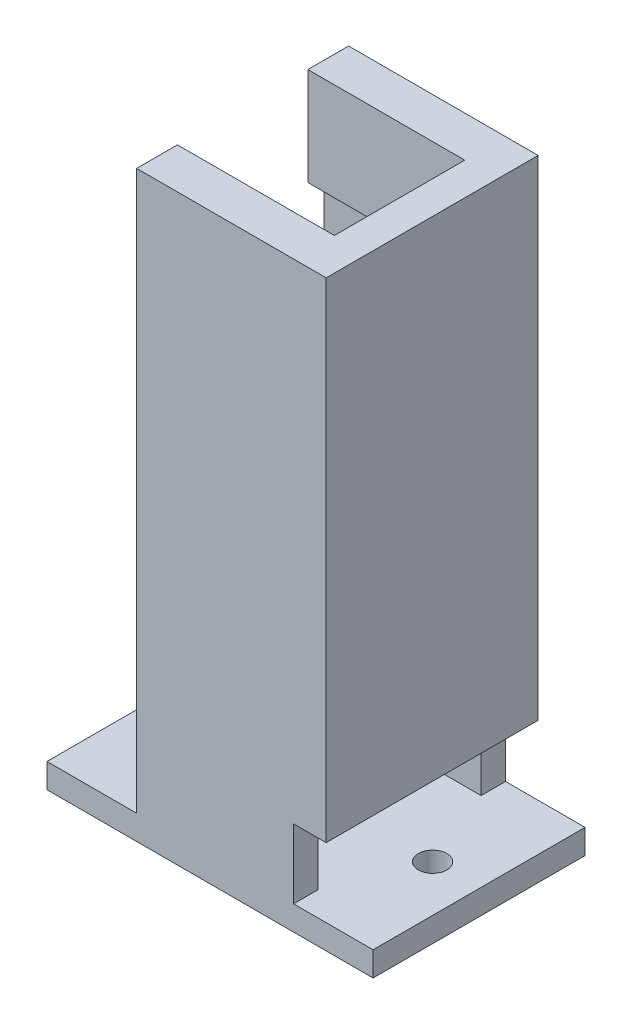
ISO-10303-21;
HEADER;
FILE_DESCRIPTION(('STEP AP214'),'2;1');
FILE_NAME('part.step','',(''),(''),'','','');
FILE_SCHEMA(('AUTOMOTIVE_DESIGN { 1 0 10303 214 1 1 1 1 }'));
ENDSEC;
DATA;
#1=APPLICATION_CONTEXT('core data for automotive mechanical design processes');
#2=APPLICATION_PROTOCOL_DEFINITION('international standard','automotive_design',2000,#1);
#3=PRODUCT_CONTEXT('',#1,'mechanical');
#4=PRODUCT('Part','Part','',(#3));
#5=PRODUCT_RELATED_PRODUCT_CATEGORY('part','',(#4));
#6=PRODUCT_DEFINITION_FORMATION('','',#4);
#7=PRODUCT_DEFINITION_CONTEXT('part definition',#1,'design');
#8=PRODUCT_DEFINITION('design','',#6,#7);
#9=PRODUCT_DEFINITION_SHAPE('','',#8);
#10=(LENGTH_UNIT() NAMED_UNIT(*) SI_UNIT(.MILLI.,.METRE.));
#11=(NAMED_UNIT(*) PLANE_ANGLE_UNIT() SI_UNIT($,.RADIAN.));
#12=(NAMED_UNIT(*) SI_UNIT($,.STERADIAN.) SOLID_ANGLE_UNIT());
#13=UNCERTAINTY_MEASURE_WITH_UNIT(LENGTH_MEASURE(1.E-05),#10,'distance_accuracy_value','');
#14=(GEOMETRIC_REPRESENTATION_CONTEXT(3) GLOBAL_UNCERTAINTY_ASSIGNED_CONTEXT((#13)) GLOBAL_UNIT_ASSIGNED_CONTEXT((#10,
#11,#12)) REPRESENTATION_CONTEXT('',''));
#15=CARTESIAN_POINT('',(0.,0.,0.));
#16=DIRECTION('',(0.,0.,1.));
#17=DIRECTION('',(1.,0.,0.));
#18=AXIS2_PLACEMENT_3D('',#15,#16,#17);
#19=CARTESIAN_POINT('',(10.25,59.5,13.));
#20=DIRECTION('',(-1.,0.,0.));
#21=DIRECTION('',(0.,0.,1.));
#22=AXIS2_PLACEMENT_3D('',#19,#20,#21);
#23=PLANE('',#22);
#24=DIRECTION('',(0.,0.,-1.));
#25=VECTOR('',#24,1.);
#26=CARTESIAN_POINT('',(10.25,11.5,13.));
#27=LINE('',#26,#25);
#28=CARTESIAN_POINT('',(10.25,11.5,13.));
#29=VERTEX_POINT('',#28);
#30=CARTESIAN_POINT('',(10.25,11.5,10.));
#31=VERTEX_POINT('',#30);
#32=EDGE_CURVE('E56',#29,#31,#27,.T.);
#33=ORIENTED_EDGE('',*,*,#32,.F.);
#34=DIRECTION('',(0.,-1.,0.));
#35=VECTOR('',#34,1.);
#36=CARTESIAN_POINT('',(10.25,59.5,13.));
#37=LINE('',#36,#35);
#38=CARTESIAN_POINT('',(10.25,3.,13.));
#39=VERTEX_POINT('',#38);
#40=EDGE_CURVE('E198',#29,#39,#37,.T.);
#41=ORIENTED_EDGE('',*,*,#40,.T.);
#42=DIRECTION('',(0.,0.,-1.));
#43=VECTOR('',#42,1.);
#44=CARTESIAN_POINT('',(10.25,3.,13.));
#45=LINE('',#44,#43);
#46=CARTESIAN_POINT('',(10.25,3.,10.));
#47=VERTEX_POINT('',#46);
#48=EDGE_CURVE('E305',#39,#47,#45,.T.);
#49=ORIENTED_EDGE('',*,*,#48,.T.);
#50=DIRECTION('',(0.,-1.,0.));
#51=VECTOR('',#50,1.);
#52=CARTESIAN_POINT('',(10.25,59.5,10.));
#53=LINE('',#52,#51);
#54=EDGE_CURVE('E61',#31,#47,#53,.T.);
#55=ORIENTED_EDGE('',*,*,#54,.F.);
#56=EDGE_LOOP('',(#33,#41,#49,#55));
#57=FACE_BOUND('',#56,.T.);
#58=ADVANCED_FACE('F39',(#57),#23,.F.);
#59=CARTESIAN_POINT('',(10.25,59.5,-13.));
#60=DIRECTION('',(-1.,0.,0.));
#61=DIRECTION('',(0.,0.,1.));
#62=AXIS2_PLACEMENT_3D('',#59,#60,#61);
#63=PLANE('',#62);
#64=CARTESIAN_POINT('',(10.25,11.5,-9.99999999999999));
#65=VERTEX_POINT('',#64);
#66=CARTESIAN_POINT('',(10.25,11.5,-13.));
#67=VERTEX_POINT('',#66);
#68=EDGE_CURVE('E485',#65,#67,#27,.T.);
#69=ORIENTED_EDGE('',*,*,#68,.F.);
#70=DIRECTION('',(0.,-1.,0.));
#71=VECTOR('',#70,1.);
#72=CARTESIAN_POINT('',(10.25,59.5,-10.));
#73=LINE('',#72,#71);
#74=CARTESIAN_POINT('',(10.25,3.,-10.));
#75=VERTEX_POINT('',#74);
#76=EDGE_CURVE('E288',#65,#75,#73,.T.);
#77=ORIENTED_EDGE('',*,*,#76,.T.);
#78=DIRECTION('',(0.,0.,-1.));
#79=VECTOR('',#78,1.);
#80=CARTESIAN_POINT('',(10.25,3.,-13.));
#81=LINE('',#80,#79);
#82=CARTESIAN_POINT('',(10.25,3.,-13.));
#83=VERTEX_POINT('',#82);
#84=EDGE_CURVE('E272',#75,#83,#81,.T.);
#85=ORIENTED_EDGE('',*,*,#84,.T.);
#86=DIRECTION('',(0.,-1.,0.));
#87=VECTOR('',#86,1.);
#88=CARTESIAN_POINT('',(10.25,59.5,-13.));
#89=LINE('',#88,#87);
#90=EDGE_CURVE('E285',#67,#83,#89,.T.);
#91=ORIENTED_EDGE('',*,*,#90,.F.);
#92=EDGE_LOOP('',(#69,#77,#85,#91));
#93=FACE_BOUND('',#92,.T.);
#94=ADVANCED_FACE('F425',(#93),#63,.F.);
#95=CARTESIAN_POINT('',(0.,3.,0.));
#96=DIRECTION('',(0.,1.,0.));
#97=DIRECTION('',(0.,0.,1.));
#98=AXIS2_PLACEMENT_3D('',#95,#96,#97);
#99=PLANE('',#98);
#100=CARTESIAN_POINT('',(0.,3.,0.));
#101=DIRECTION('',(0.,1.,0.));
#102=DIRECTION('',(0.,0.,1.));
#103=AXIS2_PLACEMENT_3D('',#100,#101,#102);
#104=CIRCLE('',#103,2.5);
#105=CARTESIAN_POINT('',(0.,3.,2.5));
#106=VERTEX_POINT('',#105);
#107=EDGE_CURVE('E200',#106,#106,#104,.T.);
#108=ORIENTED_EDGE('',*,*,#107,.F.);
#109=EDGE_LOOP('',(#108));
#110=FACE_BOUND('',#109,.T.);
#111=CARTESIAN_POINT('',(14.3,3.,0.));
#112=DIRECTION('',(0.,1.,0.));
#113=DIRECTION('',(0.,0.,1.));
#114=AXIS2_PLACEMENT_3D('',#111,#112,#113);
#115=CIRCLE('',#114,1.75);
#116=CARTESIAN_POINT('',(14.3,3.,1.74999999999999));
#117=VERTEX_POINT('',#116);
#118=EDGE_CURVE('E329',#117,#117,#115,.T.);
#119=ORIENTED_EDGE('',*,*,#118,.F.);
#120=EDGE_LOOP('',(#119));
#121=FACE_BOUND('',#120,.T.);
#122=CARTESIAN_POINT('',(-14.3,3.,0.));
#123=DIRECTION('',(0.,1.,0.));
#124=DIRECTION('',(0.,0.,-1.));
#125=AXIS2_PLACEMENT_3D('',#122,#123,#124);
#126=CIRCLE('',#125,1.75000000000001);
#127=CARTESIAN_POINT('',(-14.3,3.,-1.75000000000001));
#128=VERTEX_POINT('',#127);
#129=EDGE_CURVE('E323',#128,#128,#126,.T.);
#130=ORIENTED_EDGE('',*,*,#129,.F.);
#131=EDGE_LOOP('',(#130));
#132=FACE_BOUND('',#131,.T.);
#133=DIRECTION('',(1.,0.,0.));
#134=VECTOR('',#133,1.);
#135=CARTESIAN_POINT('',(-9.00000000000001,3.,-10.));
#136=LINE('',#135,#134);
#137=CARTESIAN_POINT('',(-9.00000000000001,3.,-10.));
#138=VERTEX_POINT('',#137);
#139=EDGE_CURVE('E276',#138,#75,#136,.T.);
#140=ORIENTED_EDGE('',*,*,#139,.F.);
#141=DIRECTION('',(0.,0.,1.));
#142=VECTOR('',#141,1.);
#143=CARTESIAN_POINT('',(-9.00000000000001,3.,-13.));
#144=LINE('',#143,#142);
#145=CARTESIAN_POINT('',(-9.00000000000001,3.,-13.));
#146=VERTEX_POINT('',#145);
#147=EDGE_CURVE('E266',#146,#138,#144,.T.);
#148=ORIENTED_EDGE('',*,*,#147,.F.);
#149=DIRECTION('',(1.,0.,0.));
#150=VECTOR('',#149,1.);
#151=CARTESIAN_POINT('',(-20.,3.,-13.));
#152=LINE('',#151,#150);
#153=CARTESIAN_POINT('',(-20.,3.,-13.));
#154=VERTEX_POINT('',#153);
#155=EDGE_CURVE('E354',#154,#146,#152,.T.);
#156=ORIENTED_EDGE('',*,*,#155,.F.);
#157=DIRECTION('',(0.,0.,1.));
#158=VECTOR('',#157,1.);
#159=CARTESIAN_POINT('',(-20.,3.,-13.));
#160=LINE('',#159,#158);
#161=CARTESIAN_POINT('',(-20.,3.,13.));
#162=VERTEX_POINT('',#161);
#163=EDGE_CURVE('E340',#154,#162,#160,.T.);
#164=ORIENTED_EDGE('',*,*,#163,.T.);
#165=DIRECTION('',(1.,0.,0.));
#166=VECTOR('',#165,1.);
#167=CARTESIAN_POINT('',(-20.,3.,13.));
#168=LINE('',#167,#166);
#169=CARTESIAN_POINT('',(-9.00000000000001,3.,13.));
#170=VERTEX_POINT('',#169);
#171=EDGE_CURVE('E346',#162,#170,#168,.T.);
#172=ORIENTED_EDGE('',*,*,#171,.T.);
#173=DIRECTION('',(0.,0.,1.));
#174=VECTOR('',#173,1.);
#175=CARTESIAN_POINT('',(-9.00000000000001,3.,13.));
#176=LINE('',#175,#174);
#177=CARTESIAN_POINT('',(-9.00000000000001,3.,10.));
#178=VERTEX_POINT('',#177);
#179=EDGE_CURVE('E295',#178,#170,#176,.T.);
#180=ORIENTED_EDGE('',*,*,#179,.F.);
#181=DIRECTION('',(-1.,0.,0.));
#182=VECTOR('',#181,1.);
#183=CARTESIAN_POINT('',(-9.00000000000001,3.,10.));
#184=LINE('',#183,#182);
#185=EDGE_CURVE('E301',#47,#178,#184,.T.);
#186=ORIENTED_EDGE('',*,*,#185,.F.);
#187=ORIENTED_EDGE('',*,*,#48,.F.);
#188=CARTESIAN_POINT('',(20.,3.,13.));
#189=VERTEX_POINT('',#188);
#190=EDGE_CURVE('E344',#39,#189,#168,.T.);
#191=ORIENTED_EDGE('',*,*,#190,.T.);
#192=DIRECTION('',(0.,0.,1.));
#193=VECTOR('',#192,1.);
#194=CARTESIAN_POINT('',(20.,3.,-13.));
#195=LINE('',#194,#193);
#196=CARTESIAN_POINT('',(20.,3.,-13.));
#197=VERTEX_POINT('',#196);
#198=EDGE_CURVE('E349',#197,#189,#195,.T.);
#199=ORIENTED_EDGE('',*,*,#198,.F.);
#200=EDGE_CURVE('E353',#83,#197,#152,.T.);
#201=ORIENTED_EDGE('',*,*,#200,.F.);
#202=ORIENTED_EDGE('',*,*,#84,.F.);
#203=EDGE_LOOP('',(#140,#148,#156,#164,#172,#180,#186,#187,#191,#199,#201,#202));
#204=FACE_BOUND('',#203,.T.);
#205=ADVANCED_FACE('F395',(#110,#121,#132,#204),#99,.T.);
#206=CARTESIAN_POINT('',(-20.,3.,-13.));
#207=DIRECTION('',(1.,0.,0.));
#208=DIRECTION('',(0.,0.,-1.));
#209=AXIS2_PLACEMENT_3D('',#206,#207,#208);
#210=PLANE('',#209);
#211=DIRECTION('',(0.,0.,1.));
#212=VECTOR('',#211,1.);
#213=CARTESIAN_POINT('',(-20.,0.,-13.));
#214=LINE('',#213,#212);
#215=CARTESIAN_POINT('',(-20.,0.,-13.));
#216=VERTEX_POINT('',#215);
#217=CARTESIAN_POINT('',(-20.,0.,13.));
#218=VERTEX_POINT('',#217);
#219=EDGE_CURVE('E328',#216,#218,#214,.T.);
#220=ORIENTED_EDGE('',*,*,#219,.T.);
#221=DIRECTION('',(0.,-1.,0.));
#222=VECTOR('',#221,1.);
#223=CARTESIAN_POINT('',(-20.,3.,13.));
#224=LINE('',#223,#222);
#225=EDGE_CURVE('E11',#162,#218,#224,.T.);
#226=ORIENTED_EDGE('',*,*,#225,.F.);
#227=ORIENTED_EDGE('',*,*,#163,.F.);
#228=DIRECTION('',(0.,-1.,0.));
#229=VECTOR('',#228,1.);
#230=CARTESIAN_POINT('',(-20.,3.,-13.));
#231=LINE('',#230,#229);
#232=EDGE_CURVE('E358',#154,#216,#231,.T.);
#233=ORIENTED_EDGE('',*,*,#232,.T.);
#234=EDGE_LOOP('',(#220,#226,#227,#233));
#235=FACE_BOUND('',#234,.T.);
#236=ADVANCED_FACE('F41',(#235),#210,.F.);
#237=CARTESIAN_POINT('',(-20.,3.,13.));
#238=DIRECTION('',(0.,0.,-1.));
#239=DIRECTION('',(-1.,0.,0.));
#240=AXIS2_PLACEMENT_3D('',#237,#238,#239);
#241=PLANE('',#240);
#242=DIRECTION('',(1.,0.,0.));
#243=VECTOR('',#242,1.);
#244=CARTESIAN_POINT('',(-20.,0.,13.));
#245=LINE('',#244,#243);
#246=CARTESIAN_POINT('',(20.,0.,13.));
#247=VERTEX_POINT('',#246);
#248=EDGE_CURVE('E362',#218,#247,#245,.T.);
#249=ORIENTED_EDGE('',*,*,#248,.T.);
#250=DIRECTION('',(0.,-1.,0.));
#251=VECTOR('',#250,1.);
#252=CARTESIAN_POINT('',(20.,3.,13.));
#253=LINE('',#252,#251);
#254=EDGE_CURVE('E49',#189,#247,#253,.T.);
#255=ORIENTED_EDGE('',*,*,#254,.F.);
#256=ORIENTED_EDGE('',*,*,#190,.F.);
#257=ORIENTED_EDGE('',*,*,#40,.F.);
#258=DIRECTION('',(-1.,0.,0.));
#259=VECTOR('',#258,1.);
#260=CARTESIAN_POINT('',(14.25,11.5,13.));
#261=LINE('',#260,#259);
#262=CARTESIAN_POINT('',(14.25,11.5,13.));
#263=VERTEX_POINT('',#262);
#264=EDGE_CURVE('E175',#263,#29,#261,.T.);
#265=ORIENTED_EDGE('',*,*,#264,.F.);
#266=DIRECTION('',(0.,-1.,0.));
#267=VECTOR('',#266,1.);
#268=CARTESIAN_POINT('',(14.25,11.5,13.));
#269=LINE('',#268,#267);
#270=CARTESIAN_POINT('',(14.25,71.5,13.));
#271=VERTEX_POINT('',#270);
#272=EDGE_CURVE('E183',#271,#263,#269,.T.);
#273=ORIENTED_EDGE('',*,*,#272,.F.);
#274=DIRECTION('',(1.,0.,0.));
#275=VECTOR('',#274,1.);
#276=CARTESIAN_POINT('',(-9.00000000000001,71.5,13.));
#277=LINE('',#276,#275);
#278=CARTESIAN_POINT('',(-9.00000000000001,71.5,13.));
#279=VERTEX_POINT('',#278);
#280=EDGE_CURVE('E213',#279,#271,#277,.T.);
#281=ORIENTED_EDGE('',*,*,#280,.F.);
#282=DIRECTION('',(0.,-1.,0.));
#283=VECTOR('',#282,1.);
#284=CARTESIAN_POINT('',(-9.00000000000001,59.5,13.));
#285=LINE('',#284,#283);
#286=EDGE_CURVE('E319',#279,#170,#285,.T.);
#287=ORIENTED_EDGE('',*,*,#286,.T.);
#288=ORIENTED_EDGE('',*,*,#171,.F.);
#289=ORIENTED_EDGE('',*,*,#225,.T.);
#290=EDGE_LOOP('',(#249,#255,#256,#257,#265,#273,#281,#287,#288,#289));
#291=FACE_BOUND('',#290,.T.);
#292=ADVANCED_FACE('F196',(#291),#241,.F.);
#293=CARTESIAN_POINT('',(20.,3.,-13.));
#294=DIRECTION('',(1.,0.,0.));
#295=DIRECTION('',(0.,0.,-1.));
#296=AXIS2_PLACEMENT_3D('',#293,#294,#295);
#297=PLANE('',#296);
#298=DIRECTION('',(0.,0.,1.));
#299=VECTOR('',#298,1.);
#300=CARTESIAN_POINT('',(20.,0.,-13.));
#301=LINE('',#300,#299);
#302=CARTESIAN_POINT('',(20.,0.,-13.));
#303=VERTEX_POINT('',#302);
#304=EDGE_CURVE('E365',#303,#247,#301,.T.);
#305=ORIENTED_EDGE('',*,*,#304,.F.);
#306=DIRECTION('',(0.,-1.,0.));
#307=VECTOR('',#306,1.);
#308=CARTESIAN_POINT('',(20.,3.,-13.));
#309=LINE('',#308,#307);
#310=EDGE_CURVE('E374',#197,#303,#309,.T.);
#311=ORIENTED_EDGE('',*,*,#310,.F.);
#312=ORIENTED_EDGE('',*,*,#198,.T.);
#313=ORIENTED_EDGE('',*,*,#254,.T.);
#314=EDGE_LOOP('',(#305,#311,#312,#313));
#315=FACE_BOUND('',#314,.T.);
#316=ADVANCED_FACE('F381',(#315),#297,.T.);
#317=CARTESIAN_POINT('',(-20.,3.,-13.));
#318=DIRECTION('',(0.,0.,-1.));
#319=DIRECTION('',(-1.,0.,0.));
#320=AXIS2_PLACEMENT_3D('',#317,#318,#319);
#321=PLANE('',#320);
#322=DIRECTION('',(1.,0.,0.));
#323=VECTOR('',#322,1.);
#324=CARTESIAN_POINT('',(-20.,0.,-13.));
#325=LINE('',#324,#323);
#326=EDGE_CURVE('E345',#216,#303,#325,.T.);
#327=ORIENTED_EDGE('',*,*,#326,.F.);
#328=ORIENTED_EDGE('',*,*,#232,.F.);
#329=ORIENTED_EDGE('',*,*,#155,.T.);
#330=DIRECTION('',(0.,-1.,0.));
#331=VECTOR('',#330,1.);
#332=CARTESIAN_POINT('',(-9.00000000000001,59.5,-13.));
#333=LINE('',#332,#331);
#334=CARTESIAN_POINT('',(-9.00000000000001,71.5,-13.));
#335=VERTEX_POINT('',#334);
#336=EDGE_CURVE('E271',#335,#146,#333,.T.);
#337=ORIENTED_EDGE('',*,*,#336,.F.);
#338=DIRECTION('',(-1.,0.,0.));
#339=VECTOR('',#338,1.);
#340=CARTESIAN_POINT('',(-9.00000000000001,71.5,-13.));
#341=LINE('',#340,#339);
#342=CARTESIAN_POINT('',(14.25,71.5,-13.));
#343=VERTEX_POINT('',#342);
#344=EDGE_CURVE('E239',#343,#335,#341,.T.);
#345=ORIENTED_EDGE('',*,*,#344,.F.);
#346=DIRECTION('',(0.,1.,0.));
#347=VECTOR('',#346,1.);
#348=CARTESIAN_POINT('',(14.25,11.5,-13.));
#349=LINE('',#348,#347);
#350=CARTESIAN_POINT('',(14.25,11.5,-13.));
#351=VERTEX_POINT('',#350);
#352=EDGE_CURVE('E182',#351,#343,#349,.T.);
#353=ORIENTED_EDGE('',*,*,#352,.F.);
#354=DIRECTION('',(-1.,0.,0.));
#355=VECTOR('',#354,1.);
#356=CARTESIAN_POINT('',(14.25,11.5,-13.));
#357=LINE('',#356,#355);
#358=EDGE_CURVE('E177',#351,#67,#357,.T.);
#359=ORIENTED_EDGE('',*,*,#358,.T.);
#360=ORIENTED_EDGE('',*,*,#90,.T.);
#361=ORIENTED_EDGE('',*,*,#200,.T.);
#362=ORIENTED_EDGE('',*,*,#310,.T.);
#363=EDGE_LOOP('',(#327,#328,#329,#337,#345,#353,#359,#360,#361,#362));
#364=FACE_BOUND('',#363,.T.);
#365=ADVANCED_FACE('F390',(#364),#321,.T.);
#366=CARTESIAN_POINT('',(0.,0.,0.));
#367=DIRECTION('',(0.,1.,0.));
#368=DIRECTION('',(0.,0.,1.));
#369=AXIS2_PLACEMENT_3D('',#366,#367,#368);
#370=PLANE('',#369);
#371=CARTESIAN_POINT('',(0.,0.,0.));
#372=DIRECTION('',(0.,1.,0.));
#373=DIRECTION('',(0.,0.,1.));
#374=AXIS2_PLACEMENT_3D('',#371,#372,#373);
#375=CIRCLE('',#374,2.5);
#376=CARTESIAN_POINT('',(0.,0.,2.5));
#377=VERTEX_POINT('',#376);
#378=EDGE_CURVE('E43',#377,#377,#375,.T.);
#379=ORIENTED_EDGE('',*,*,#378,.T.);
#380=EDGE_LOOP('',(#379));
#381=FACE_BOUND('',#380,.T.);
#382=CARTESIAN_POINT('',(14.3,0.,0.));
#383=DIRECTION('',(0.,1.,0.));
#384=DIRECTION('',(0.,0.,1.));
#385=AXIS2_PLACEMENT_3D('',#382,#383,#384);
#386=CIRCLE('',#385,1.75);
#387=CARTESIAN_POINT('',(14.3,0.,1.74999999999999));
#388=VERTEX_POINT('',#387);
#389=EDGE_CURVE('E324',#388,#388,#386,.T.);
#390=ORIENTED_EDGE('',*,*,#389,.T.);
#391=EDGE_LOOP('',(#390));
#392=FACE_BOUND('',#391,.T.);
#393=CARTESIAN_POINT('',(-14.3,0.,0.));
#394=DIRECTION('',(0.,1.,0.));
#395=DIRECTION('',(0.,0.,-1.));
#396=AXIS2_PLACEMENT_3D('',#393,#394,#395);
#397=CIRCLE('',#396,1.75000000000001);
#398=CARTESIAN_POINT('',(-14.3,0.,-1.75000000000001));
#399=VERTEX_POINT('',#398);
#400=EDGE_CURVE('E333',#399,#399,#397,.T.);
#401=ORIENTED_EDGE('',*,*,#400,.T.);
#402=EDGE_LOOP('',(#401));
#403=FACE_BOUND('',#402,.T.);
#404=ORIENTED_EDGE('',*,*,#219,.F.);
#405=ORIENTED_EDGE('',*,*,#326,.T.);
#406=ORIENTED_EDGE('',*,*,#304,.T.);
#407=ORIENTED_EDGE('',*,*,#248,.F.);
#408=EDGE_LOOP('',(#404,#405,#406,#407));
#409=FACE_BOUND('',#408,.T.);
#410=ADVANCED_FACE('F387',(#381,#392,#403,#409),#370,.F.);
#411=CARTESIAN_POINT('',(-14.3,0.,0.));
#412=DIRECTION('',(0.,1.,0.));
#413=DIRECTION('',(0.,0.,1.));
#414=AXIS2_PLACEMENT_3D('',#411,#412,#413);
#415=CYLINDRICAL_SURFACE('',#414,1.75000000000001);
#416=ORIENTED_EDGE('',*,*,#400,.F.);
#417=EDGE_LOOP('',(#416));
#418=FACE_BOUND('',#417,.T.);
#419=ORIENTED_EDGE('',*,*,#129,.T.);
#420=EDGE_LOOP('',(#419));
#421=FACE_BOUND('',#420,.T.);
#422=ADVANCED_FACE('F443',(#418,#421),#415,.F.);
#423=CARTESIAN_POINT('',(14.3,0.,0.));
#424=DIRECTION('',(0.,1.,0.));
#425=DIRECTION('',(0.,0.,1.));
#426=AXIS2_PLACEMENT_3D('',#423,#424,#425);
#427=CYLINDRICAL_SURFACE('',#426,1.75);
#428=ORIENTED_EDGE('',*,*,#389,.F.);
#429=EDGE_LOOP('',(#428));
#430=FACE_BOUND('',#429,.T.);
#431=ORIENTED_EDGE('',*,*,#118,.T.);
#432=EDGE_LOOP('',(#431));
#433=FACE_BOUND('',#432,.T.);
#434=ADVANCED_FACE('F439',(#430,#433),#427,.F.);
#435=CARTESIAN_POINT('',(-9.00000000000001,59.5,13.));
#436=DIRECTION('',(1.,0.,0.));
#437=DIRECTION('',(0.,0.,-1.));
#438=AXIS2_PLACEMENT_3D('',#435,#436,#437);
#439=PLANE('',#438);
#440=ORIENTED_EDGE('',*,*,#179,.T.);
#441=ORIENTED_EDGE('',*,*,#286,.F.);
#442=DIRECTION('',(0.,0.,1.));
#443=VECTOR('',#442,1.);
#444=CARTESIAN_POINT('',(-9.00000000000001,71.5,13.));
#445=LINE('',#444,#443);
#446=CARTESIAN_POINT('',(-9.00000000000001,71.5,8.));
#447=VERTEX_POINT('',#446);
#448=EDGE_CURVE('E209',#447,#279,#445,.T.);
#449=ORIENTED_EDGE('',*,*,#448,.F.);
#450=DIRECTION('',(0.,-1.,0.));
#451=VECTOR('',#450,1.);
#452=CARTESIAN_POINT('',(-9.00000000000001,71.5,8.));
#453=LINE('',#452,#451);
#454=CARTESIAN_POINT('',(-9.00000000000001,59.5,8.));
#455=VERTEX_POINT('',#454);
#456=EDGE_CURVE('E220',#447,#455,#453,.T.);
#457=ORIENTED_EDGE('',*,*,#456,.T.);
#458=DIRECTION('',(0.,0.,1.));
#459=VECTOR('',#458,1.);
#460=CARTESIAN_POINT('',(-9.00000000000001,59.5,13.));
#461=LINE('',#460,#459);
#462=CARTESIAN_POINT('',(-9.00000000000001,59.5,10.));
#463=VERTEX_POINT('',#462);
#464=EDGE_CURVE('E221',#455,#463,#461,.T.);
#465=ORIENTED_EDGE('',*,*,#464,.T.);
#466=DIRECTION('',(0.,-1.,0.));
#467=VECTOR('',#466,1.);
#468=CARTESIAN_POINT('',(-9.00000000000001,59.5,10.));
#469=LINE('',#468,#467);
#470=EDGE_CURVE('E300',#463,#178,#469,.T.);
#471=ORIENTED_EDGE('',*,*,#470,.T.);
#472=EDGE_LOOP('',(#440,#441,#449,#457,#465,#471));
#473=FACE_BOUND('',#472,.T.);
#474=ADVANCED_FACE('F436',(#473),#439,.F.);
#475=CARTESIAN_POINT('',(-9.00000000000001,59.5,10.));
#476=DIRECTION('',(0.,0.,1.));
#477=DIRECTION('',(1.,0.,0.));
#478=AXIS2_PLACEMENT_3D('',#475,#476,#477);
#479=PLANE('',#478);
#480=ORIENTED_EDGE('',*,*,#185,.T.);
#481=ORIENTED_EDGE('',*,*,#470,.F.);
#482=DIRECTION('',(-1.,0.,0.));
#483=VECTOR('',#482,1.);
#484=CARTESIAN_POINT('',(-9.00000000000001,59.5,10.));
#485=LINE('',#484,#483);
#486=CARTESIAN_POINT('',(10.25,59.5,10.));
#487=VERTEX_POINT('',#486);
#488=EDGE_CURVE('E296',#487,#463,#485,.T.);
#489=ORIENTED_EDGE('',*,*,#488,.F.);
#490=EDGE_CURVE('E314',#487,#31,#53,.T.);
#491=ORIENTED_EDGE('',*,*,#490,.T.);
#492=ORIENTED_EDGE('',*,*,#54,.T.);
#493=EDGE_LOOP('',(#480,#481,#489,#491,#492));
#494=FACE_BOUND('',#493,.T.);
#495=ADVANCED_FACE('F434',(#494),#479,.F.);
#496=CARTESIAN_POINT('',(-9.00000000000001,59.5,-13.));
#497=DIRECTION('',(1.,0.,0.));
#498=DIRECTION('',(0.,0.,-1.));
#499=AXIS2_PLACEMENT_3D('',#496,#497,#498);
#500=PLANE('',#499);
#501=ORIENTED_EDGE('',*,*,#147,.T.);
#502=DIRECTION('',(0.,-1.,0.));
#503=VECTOR('',#502,1.);
#504=CARTESIAN_POINT('',(-9.00000000000001,59.5,-10.));
#505=LINE('',#504,#503);
#506=CARTESIAN_POINT('',(-9.00000000000001,59.5,-10.));
#507=VERTEX_POINT('',#506);
#508=EDGE_CURVE('E292',#507,#138,#505,.T.);
#509=ORIENTED_EDGE('',*,*,#508,.F.);
#510=DIRECTION('',(0.,0.,1.));
#511=VECTOR('',#510,1.);
#512=CARTESIAN_POINT('',(-9.00000000000001,59.5,-13.));
#513=LINE('',#512,#511);
#514=CARTESIAN_POINT('',(-9.00000000000001,59.5,-8.));
#515=VERTEX_POINT('',#514);
#516=EDGE_CURVE('E254',#507,#515,#513,.T.);
#517=ORIENTED_EDGE('',*,*,#516,.T.);
#518=DIRECTION('',(0.,-1.,0.));
#519=VECTOR('',#518,1.);
#520=CARTESIAN_POINT('',(-9.00000000000001,71.5,-8.));
#521=LINE('',#520,#519);
#522=CARTESIAN_POINT('',(-9.00000000000001,71.5,-8.));
#523=VERTEX_POINT('',#522);
#524=EDGE_CURVE('E262',#523,#515,#521,.T.);
#525=ORIENTED_EDGE('',*,*,#524,.F.);
#526=DIRECTION('',(0.,0.,1.));
#527=VECTOR('',#526,1.);
#528=CARTESIAN_POINT('',(-9.00000000000001,71.5,-13.));
#529=LINE('',#528,#527);
#530=EDGE_CURVE('E243',#335,#523,#529,.T.);
#531=ORIENTED_EDGE('',*,*,#530,.F.);
#532=ORIENTED_EDGE('',*,*,#336,.T.);
#533=EDGE_LOOP('',(#501,#509,#517,#525,#531,#532));
#534=FACE_BOUND('',#533,.T.);
#535=ADVANCED_FACE('F470',(#534),#500,.F.);
#536=CARTESIAN_POINT('',(-9.00000000000001,59.5,-10.));
#537=DIRECTION('',(0.,0.,-1.));
#538=DIRECTION('',(-1.,0.,0.));
#539=AXIS2_PLACEMENT_3D('',#536,#537,#538);
#540=PLANE('',#539);
#541=ORIENTED_EDGE('',*,*,#139,.T.);
#542=ORIENTED_EDGE('',*,*,#76,.F.);
#543=CARTESIAN_POINT('',(10.25,59.5,-10.));
#544=VERTEX_POINT('',#543);
#545=EDGE_CURVE('E289',#544,#65,#73,.T.);
#546=ORIENTED_EDGE('',*,*,#545,.F.);
#547=DIRECTION('',(1.,0.,0.));
#548=VECTOR('',#547,1.);
#549=CARTESIAN_POINT('',(-9.00000000000001,59.5,-10.));
#550=LINE('',#549,#548);
#551=EDGE_CURVE('E267',#507,#544,#550,.T.);
#552=ORIENTED_EDGE('',*,*,#551,.F.);
#553=ORIENTED_EDGE('',*,*,#508,.T.);
#554=EDGE_LOOP('',(#541,#542,#546,#552,#553));
#555=FACE_BOUND('',#554,.T.);
#556=ADVANCED_FACE('F494',(#555),#540,.F.);
#557=CARTESIAN_POINT('',(0.,59.5,0.));
#558=DIRECTION('',(0.,1.,0.));
#559=DIRECTION('',(0.,0.,1.));
#560=AXIS2_PLACEMENT_3D('',#557,#558,#559);
#561=PLANE('',#560);
#562=ORIENTED_EDGE('',*,*,#516,.F.);
#563=ORIENTED_EDGE('',*,*,#551,.T.);
#564=DIRECTION('',(0.,0.,-1.));
#565=VECTOR('',#564,1.);
#566=CARTESIAN_POINT('',(10.25,59.5,-13.));
#567=LINE('',#566,#565);
#568=CARTESIAN_POINT('',(10.25,59.5,-8.));
#569=VERTEX_POINT('',#568);
#570=EDGE_CURVE('E238',#569,#544,#567,.T.);
#571=ORIENTED_EDGE('',*,*,#570,.F.);
#572=DIRECTION('',(1.,0.,0.));
#573=VECTOR('',#572,1.);
#574=CARTESIAN_POINT('',(-9.00000000000001,59.5,-8.));
#575=LINE('',#574,#573);
#576=EDGE_CURVE('E244',#515,#569,#575,.T.);
#577=ORIENTED_EDGE('',*,*,#576,.F.);
#578=EDGE_LOOP('',(#562,#563,#571,#577));
#579=FACE_BOUND('',#578,.T.);
#580=ADVANCED_FACE('F497',(#579),#561,.F.);
#581=CARTESIAN_POINT('',(-9.00000000000001,71.5,-8.));
#582=DIRECTION('',(0.,0.,-1.));
#583=DIRECTION('',(-1.,0.,0.));
#584=AXIS2_PLACEMENT_3D('',#581,#582,#583);
#585=PLANE('',#584);
#586=ORIENTED_EDGE('',*,*,#576,.T.);
#587=DIRECTION('',(0.,-1.,0.));
#588=VECTOR('',#587,1.);
#589=CARTESIAN_POINT('',(10.25,71.5,-8.));
#590=LINE('',#589,#588);
#591=CARTESIAN_POINT('',(10.25,71.5,-8.));
#592=VERTEX_POINT('',#591);
#593=EDGE_CURVE('E251',#592,#569,#590,.T.);
#594=ORIENTED_EDGE('',*,*,#593,.F.);
#595=DIRECTION('',(1.,0.,0.));
#596=VECTOR('',#595,1.);
#597=CARTESIAN_POINT('',(-9.00000000000001,71.5,-8.));
#598=LINE('',#597,#596);
#599=EDGE_CURVE('E247',#523,#592,#598,.T.);
#600=ORIENTED_EDGE('',*,*,#599,.F.);
#601=ORIENTED_EDGE('',*,*,#524,.T.);
#602=EDGE_LOOP('',(#586,#594,#600,#601));
#603=FACE_BOUND('',#602,.T.);
#604=ADVANCED_FACE('F477',(#603),#585,.F.);
#605=CARTESIAN_POINT('',(0.,71.5,0.));
#606=DIRECTION('',(0.,1.,0.));
#607=DIRECTION('',(0.,0.,1.));
#608=AXIS2_PLACEMENT_3D('',#605,#606,#607);
#609=PLANE('',#608);
#610=ORIENTED_EDGE('',*,*,#599,.T.);
#611=DIRECTION('',(0.,0.,1.));
#612=VECTOR('',#611,1.);
#613=CARTESIAN_POINT('',(10.25,71.5,13.));
#614=LINE('',#613,#612);
#615=CARTESIAN_POINT('',(10.25,71.5,8.00000000000001));
#616=VERTEX_POINT('',#615);
#617=EDGE_CURVE('E193',#592,#616,#614,.T.);
#618=ORIENTED_EDGE('',*,*,#617,.T.);
#619=DIRECTION('',(-1.,0.,0.));
#620=VECTOR('',#619,1.);
#621=CARTESIAN_POINT('',(-9.00000000000001,71.5,8.));
#622=LINE('',#621,#620);
#623=EDGE_CURVE('E217',#616,#447,#622,.T.);
#624=ORIENTED_EDGE('',*,*,#623,.T.);
#625=ORIENTED_EDGE('',*,*,#448,.T.);
#626=ORIENTED_EDGE('',*,*,#280,.T.);
#627=DIRECTION('',(0.,0.,1.));
#628=VECTOR('',#627,1.);
#629=CARTESIAN_POINT('',(14.25,71.5,13.));
#630=LINE('',#629,#628);
#631=EDGE_CURVE('E189',#343,#271,#630,.T.);
#632=ORIENTED_EDGE('',*,*,#631,.F.);
#633=ORIENTED_EDGE('',*,*,#344,.T.);
#634=ORIENTED_EDGE('',*,*,#530,.T.);
#635=EDGE_LOOP('',(#610,#618,#624,#625,#626,#632,#633,#634));
#636=FACE_BOUND('',#635,.T.);
#637=ADVANCED_FACE('F468',(#636),#609,.T.);
#638=CARTESIAN_POINT('',(-9.00000000000001,71.5,8.));
#639=DIRECTION('',(0.,0.,1.));
#640=DIRECTION('',(1.,0.,0.));
#641=AXIS2_PLACEMENT_3D('',#638,#639,#640);
#642=PLANE('',#641);
#643=DIRECTION('',(-1.,0.,0.));
#644=VECTOR('',#643,1.);
#645=CARTESIAN_POINT('',(-9.00000000000001,59.5,8.));
#646=LINE('',#645,#644);
#647=CARTESIAN_POINT('',(10.25,59.5,8.));
#648=VERTEX_POINT('',#647);
#649=EDGE_CURVE('E214',#648,#455,#646,.T.);
#650=ORIENTED_EDGE('',*,*,#649,.T.);
#651=ORIENTED_EDGE('',*,*,#456,.F.);
#652=ORIENTED_EDGE('',*,*,#623,.F.);
#653=DIRECTION('',(0.,-1.,0.));
#654=VECTOR('',#653,1.);
#655=CARTESIAN_POINT('',(10.25,71.5,8.00000000000001));
#656=LINE('',#655,#654);
#657=EDGE_CURVE('E234',#616,#648,#656,.T.);
#658=ORIENTED_EDGE('',*,*,#657,.T.);
#659=EDGE_LOOP('',(#650,#651,#652,#658));
#660=FACE_BOUND('',#659,.T.);
#661=ADVANCED_FACE('F420',(#660),#642,.F.);
#662=CARTESIAN_POINT('',(0.,59.5,0.));
#663=DIRECTION('',(0.,-1.,0.));
#664=DIRECTION('',(0.,0.,-1.));
#665=AXIS2_PLACEMENT_3D('',#662,#663,#664);
#666=PLANE('',#665);
#667=DIRECTION('',(0.,0.,-1.));
#668=VECTOR('',#667,1.);
#669=CARTESIAN_POINT('',(10.25,59.5,13.));
#670=LINE('',#669,#668);
#671=EDGE_CURVE('E225',#487,#648,#670,.T.);
#672=ORIENTED_EDGE('',*,*,#671,.F.);
#673=ORIENTED_EDGE('',*,*,#488,.T.);
#674=ORIENTED_EDGE('',*,*,#464,.F.);
#675=ORIENTED_EDGE('',*,*,#649,.F.);
#676=EDGE_LOOP('',(#672,#673,#674,#675));
#677=FACE_BOUND('',#676,.T.);
#678=ADVANCED_FACE('F411',(#677),#666,.T.);
#679=CARTESIAN_POINT('',(0.,-12.,0.));
#680=DIRECTION('',(0.,1.,0.));
#681=DIRECTION('',(0.,0.,1.));
#682=AXIS2_PLACEMENT_3D('',#679,#680,#681);
#683=CYLINDRICAL_SURFACE('',#682,2.5);
#684=ORIENTED_EDGE('',*,*,#107,.T.);
#685=EDGE_LOOP('',(#684));
#686=FACE_BOUND('',#685,.T.);
#687=ORIENTED_EDGE('',*,*,#378,.F.);
#688=EDGE_LOOP('',(#687));
#689=FACE_BOUND('',#688,.T.);
#690=ADVANCED_FACE('F408',(#686,#689),#683,.F.);
#691=CARTESIAN_POINT('',(10.25,0.,0.));
#692=DIRECTION('',(-1.,0.,0.));
#693=DIRECTION('',(0.,0.,1.));
#694=AXIS2_PLACEMENT_3D('',#691,#692,#693);
#695=PLANE('',#694);
#696=ORIENTED_EDGE('',*,*,#545,.T.);
#697=EDGE_CURVE('E483',#31,#65,#27,.T.);
#698=ORIENTED_EDGE('',*,*,#697,.F.);
#699=ORIENTED_EDGE('',*,*,#490,.F.);
#700=ORIENTED_EDGE('',*,*,#671,.T.);
#701=ORIENTED_EDGE('',*,*,#657,.F.);
#702=ORIENTED_EDGE('',*,*,#617,.F.);
#703=ORIENTED_EDGE('',*,*,#593,.T.);
#704=ORIENTED_EDGE('',*,*,#570,.T.);
#705=EDGE_LOOP('',(#696,#698,#699,#700,#701,#702,#703,#704));
#706=FACE_BOUND('',#705,.T.);
#707=ADVANCED_FACE('F410',(#706),#695,.T.);
#708=CARTESIAN_POINT('',(14.25,11.5,13.));
#709=DIRECTION('',(0.,1.,0.));
#710=DIRECTION('',(0.,0.,1.));
#711=AXIS2_PLACEMENT_3D('',#708,#709,#710);
#712=PLANE('',#711);
#713=ORIENTED_EDGE('',*,*,#32,.T.);
#714=ORIENTED_EDGE('',*,*,#697,.T.);
#715=ORIENTED_EDGE('',*,*,#68,.T.);
#716=ORIENTED_EDGE('',*,*,#358,.F.);
#717=DIRECTION('',(0.,0.,-1.));
#718=VECTOR('',#717,1.);
#719=CARTESIAN_POINT('',(14.25,11.5,13.));
#720=LINE('',#719,#718);
#721=EDGE_CURVE('E171',#263,#351,#720,.T.);
#722=ORIENTED_EDGE('',*,*,#721,.F.);
#723=ORIENTED_EDGE('',*,*,#264,.T.);
#724=EDGE_LOOP('',(#713,#714,#715,#716,#722,#723));
#725=FACE_BOUND('',#724,.T.);
#726=ADVANCED_FACE('F173',(#725),#712,.F.);
#727=CARTESIAN_POINT('',(14.25,0.,0.));
#728=DIRECTION('',(-1.,0.,0.));
#729=DIRECTION('',(0.,0.,1.));
#730=AXIS2_PLACEMENT_3D('',#727,#728,#729);
#731=PLANE('',#730);
#732=ORIENTED_EDGE('',*,*,#272,.T.);
#733=ORIENTED_EDGE('',*,*,#721,.T.);
#734=ORIENTED_EDGE('',*,*,#352,.T.);
#735=ORIENTED_EDGE('',*,*,#631,.T.);
#736=EDGE_LOOP('',(#732,#733,#734,#735));
#737=FACE_BOUND('',#736,.T.);
#738=ADVANCED_FACE('F187',(#737),#731,.F.);
#739=CLOSED_SHELL('',(#58,#94,#205,#236,#292,#316,#365,#410,#422,#434,#474,#495,#535,#556,#580,
#604,#637,#661,#678,#690,#707,#726,#738));
#740=MANIFOLD_SOLID_BREP('B2',#739);
#741=ADVANCED_BREP_SHAPE_REPRESENTATION('',(#18,#740),#14);
#742=SHAPE_DEFINITION_REPRESENTATION(#9,#741);
ENDSEC;
END-ISO-10303-21;
